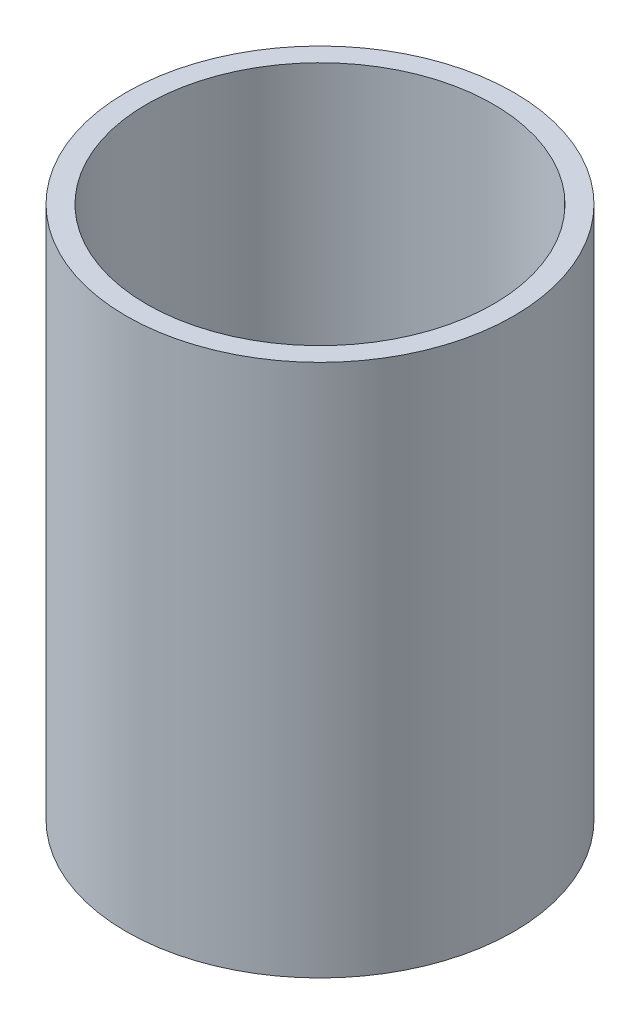
ISO-10303-21;
HEADER;
FILE_DESCRIPTION(('STEP AP214'),'2;1');
FILE_NAME('part.step','',(''),(''),'','','');
FILE_SCHEMA(('AUTOMOTIVE_DESIGN { 1 0 10303 214 1 1 1 1 }'));
ENDSEC;
DATA;
#1=APPLICATION_CONTEXT('core data for automotive mechanical design processes');
#2=APPLICATION_PROTOCOL_DEFINITION('international standard','automotive_design',2000,#1);
#3=PRODUCT_CONTEXT('',#1,'mechanical');
#4=PRODUCT('Part','Part','',(#3));
#5=PRODUCT_RELATED_PRODUCT_CATEGORY('part','',(#4));
#6=PRODUCT_DEFINITION_FORMATION('','',#4);
#7=PRODUCT_DEFINITION_CONTEXT('part definition',#1,'design');
#8=PRODUCT_DEFINITION('design','',#6,#7);
#9=PRODUCT_DEFINITION_SHAPE('','',#8);
#10=(LENGTH_UNIT() NAMED_UNIT(*) SI_UNIT(.MILLI.,.METRE.));
#11=(NAMED_UNIT(*) PLANE_ANGLE_UNIT() SI_UNIT($,.RADIAN.));
#12=(NAMED_UNIT(*) SI_UNIT($,.STERADIAN.) SOLID_ANGLE_UNIT());
#13=UNCERTAINTY_MEASURE_WITH_UNIT(LENGTH_MEASURE(1.E-05),#10,'distance_accuracy_value','');
#14=(GEOMETRIC_REPRESENTATION_CONTEXT(3) GLOBAL_UNCERTAINTY_ASSIGNED_CONTEXT((#13)) GLOBAL_UNIT_ASSIGNED_CONTEXT((#10,
#11,#12)) REPRESENTATION_CONTEXT('',''));
#15=CARTESIAN_POINT('',(0.,0.,0.));
#16=DIRECTION('',(0.,0.,1.));
#17=DIRECTION('',(1.,0.,0.));
#18=AXIS2_PLACEMENT_3D('',#15,#16,#17);
#19=CARTESIAN_POINT('',(0.,44.,0.));
#20=DIRECTION('',(0.,1.,0.));
#21=DIRECTION('',(0.,0.,1.));
#22=AXIS2_PLACEMENT_3D('',#19,#20,#21);
#23=PLANE('',#22);
#24=CARTESIAN_POINT('',(0.,44.,0.));
#25=DIRECTION('',(0.,1.,0.));
#26=DIRECTION('',(0.,0.,1.));
#27=AXIS2_PLACEMENT_3D('',#24,#25,#26);
#28=CIRCLE('',#27,15.99);
#29=CARTESIAN_POINT('',(0.,44.,15.99));
#30=VERTEX_POINT('',#29);
#31=EDGE_CURVE('E10',#30,#30,#28,.T.);
#32=ORIENTED_EDGE('',*,*,#31,.T.);
#33=EDGE_LOOP('',(#32));
#34=FACE_BOUND('',#33,.T.);
#35=CARTESIAN_POINT('',(0.,44.,0.));
#36=DIRECTION('',(0.,1.,0.));
#37=DIRECTION('',(0.,0.,1.));
#38=AXIS2_PLACEMENT_3D('',#35,#36,#37);
#39=CIRCLE('',#38,14.3);
#40=CARTESIAN_POINT('',(0.,44.,14.3));
#41=VERTEX_POINT('',#40);
#42=EDGE_CURVE('E53',#41,#41,#39,.T.);
#43=ORIENTED_EDGE('',*,*,#42,.F.);
#44=EDGE_LOOP('',(#43));
#45=FACE_BOUND('',#44,.T.);
#46=ADVANCED_FACE('F40',(#34,#45),#23,.T.);
#47=CARTESIAN_POINT('',(0.,0.,0.));
#48=DIRECTION('',(0.,1.,0.));
#49=DIRECTION('',(0.,0.,1.));
#50=AXIS2_PLACEMENT_3D('',#47,#48,#49);
#51=PLANE('',#50);
#52=CARTESIAN_POINT('',(0.,0.,0.));
#53=DIRECTION('',(0.,1.,0.));
#54=DIRECTION('',(0.,0.,1.));
#55=AXIS2_PLACEMENT_3D('',#52,#53,#54);
#56=CIRCLE('',#55,15.99);
#57=CARTESIAN_POINT('',(0.,0.,15.99));
#58=VERTEX_POINT('',#57);
#59=EDGE_CURVE('E44',#58,#58,#56,.T.);
#60=ORIENTED_EDGE('',*,*,#59,.F.);
#61=EDGE_LOOP('',(#60));
#62=FACE_BOUND('',#61,.T.);
#63=CARTESIAN_POINT('',(0.,0.,0.));
#64=DIRECTION('',(0.,1.,0.));
#65=DIRECTION('',(0.,0.,1.));
#66=AXIS2_PLACEMENT_3D('',#63,#64,#65);
#67=CIRCLE('',#66,14.3);
#68=CARTESIAN_POINT('',(0.,0.,14.3));
#69=VERTEX_POINT('',#68);
#70=EDGE_CURVE('E55',#69,#69,#67,.T.);
#71=ORIENTED_EDGE('',*,*,#70,.T.);
#72=EDGE_LOOP('',(#71));
#73=FACE_BOUND('',#72,.T.);
#74=ADVANCED_FACE('F67',(#62,#73),#51,.F.);
#75=CARTESIAN_POINT('',(0.,44.,0.));
#76=DIRECTION('',(0.,-1.,0.));
#77=DIRECTION('',(0.,0.,-1.));
#78=AXIS2_PLACEMENT_3D('',#75,#76,#77);
#79=CYLINDRICAL_SURFACE('',#78,15.99);
#80=ORIENTED_EDGE('',*,*,#31,.F.);
#81=EDGE_LOOP('',(#80));
#82=FACE_BOUND('',#81,.T.);
#83=ORIENTED_EDGE('',*,*,#59,.T.);
#84=EDGE_LOOP('',(#83));
#85=FACE_BOUND('',#84,.T.);
#86=ADVANCED_FACE('F42',(#82,#85),#79,.T.);
#87=CARTESIAN_POINT('',(0.,44.,0.));
#88=DIRECTION('',(0.,-1.,0.));
#89=DIRECTION('',(0.,0.,-1.));
#90=AXIS2_PLACEMENT_3D('',#87,#88,#89);
#91=CYLINDRICAL_SURFACE('',#90,14.3);
#92=ORIENTED_EDGE('',*,*,#42,.T.);
#93=EDGE_LOOP('',(#92));
#94=FACE_BOUND('',#93,.T.);
#95=ORIENTED_EDGE('',*,*,#70,.F.);
#96=EDGE_LOOP('',(#95));
#97=FACE_BOUND('',#96,.T.);
#98=ADVANCED_FACE('F63',(#94,#97),#91,.F.);
#99=CLOSED_SHELL('',(#46,#74,#86,#98));
#100=MANIFOLD_SOLID_BREP('B2',#99);
#101=ADVANCED_BREP_SHAPE_REPRESENTATION('',(#18,#100),#14);
#102=SHAPE_DEFINITION_REPRESENTATION(#9,#101);
ENDSEC;
END-ISO-10303-21;
